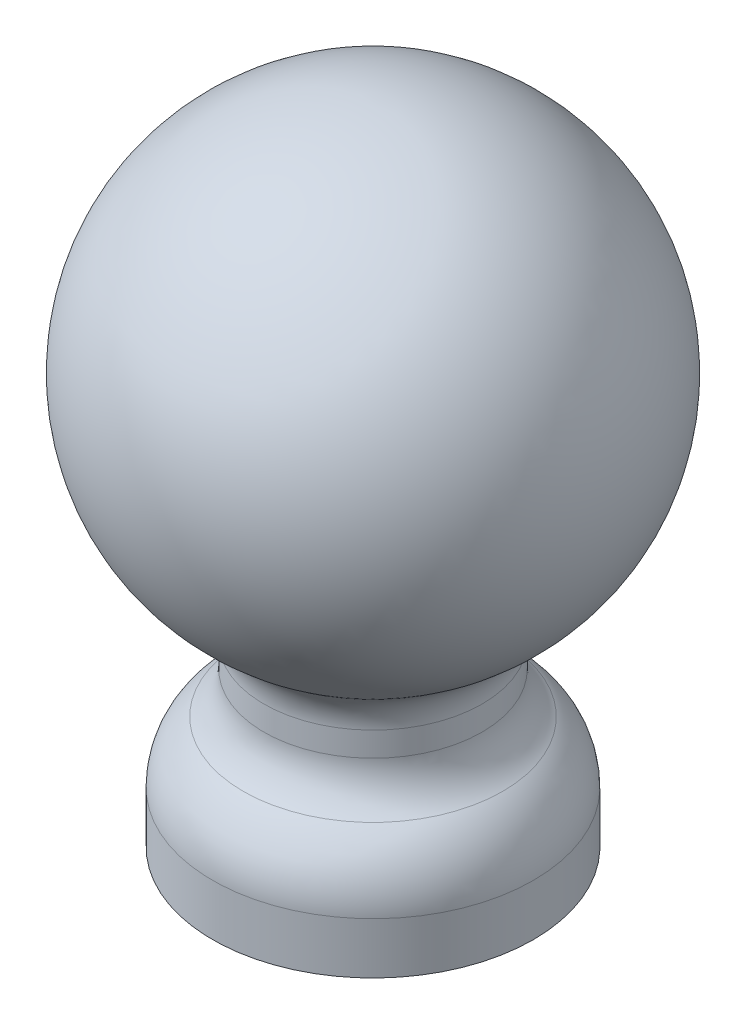
ISO-10303-21;
HEADER;
FILE_DESCRIPTION(('STEP AP214'),'2;1');
FILE_NAME('part.step','',(''),(''),'','','');
FILE_SCHEMA(('AUTOMOTIVE_DESIGN { 1 0 10303 214 1 1 1 1 }'));
ENDSEC;
DATA;
#1=APPLICATION_CONTEXT('core data for automotive mechanical design processes');
#2=APPLICATION_PROTOCOL_DEFINITION('international standard','automotive_design',2000,#1);
#3=PRODUCT_CONTEXT('',#1,'mechanical');
#4=PRODUCT('Part','Part','',(#3));
#5=PRODUCT_RELATED_PRODUCT_CATEGORY('part','',(#4));
#6=PRODUCT_DEFINITION_FORMATION('','',#4);
#7=PRODUCT_DEFINITION_CONTEXT('part definition',#1,'design');
#8=PRODUCT_DEFINITION('design','',#6,#7);
#9=PRODUCT_DEFINITION_SHAPE('','',#8);
#10=(LENGTH_UNIT() NAMED_UNIT(*) SI_UNIT(.MILLI.,.METRE.));
#11=(NAMED_UNIT(*) PLANE_ANGLE_UNIT() SI_UNIT($,.RADIAN.));
#12=(NAMED_UNIT(*) SI_UNIT($,.STERADIAN.) SOLID_ANGLE_UNIT());
#13=UNCERTAINTY_MEASURE_WITH_UNIT(LENGTH_MEASURE(1.E-05),#10,'distance_accuracy_value','');
#14=(GEOMETRIC_REPRESENTATION_CONTEXT(3) GLOBAL_UNCERTAINTY_ASSIGNED_CONTEXT((#13)) GLOBAL_UNIT_ASSIGNED_CONTEXT((#10,
#11,#12)) REPRESENTATION_CONTEXT('',''));
#15=CARTESIAN_POINT('',(0.,0.,0.));
#16=DIRECTION('',(0.,0.,1.));
#17=DIRECTION('',(1.,0.,0.));
#18=AXIS2_PLACEMENT_3D('',#15,#16,#17);
#19=CARTESIAN_POINT('',(0.,0.,0.));
#20=DIRECTION('',(0.,-1.,0.));
#21=DIRECTION('',(1.,0.,0.));
#22=AXIS2_PLACEMENT_3D('',#19,#20,#21);
#23=PLANE('',#22);
#24=CARTESIAN_POINT('',(0.,0.,0.));
#25=DIRECTION('',(0.,-1.,0.));
#26=DIRECTION('',(0.,0.,-1.));
#27=AXIS2_PLACEMENT_3D('',#24,#25,#26);
#28=CIRCLE('',#27,2.09999999999999);
#29=CARTESIAN_POINT('',(0.,0.,-2.09999999999999));
#30=VERTEX_POINT('',#29);
#31=EDGE_CURVE('E57',#30,#30,#28,.T.);
#32=ORIENTED_EDGE('',*,*,#31,.F.);
#33=EDGE_LOOP('',(#32));
#34=FACE_BOUND('',#33,.T.);
#35=CARTESIAN_POINT('',(0.,0.,0.));
#36=DIRECTION('',(0.,-1.,0.));
#37=DIRECTION('',(1.,0.,0.));
#38=AXIS2_PLACEMENT_3D('',#35,#36,#37);
#39=CIRCLE('',#38,12.5);
#40=CARTESIAN_POINT('',(12.5,0.,0.));
#41=VERTEX_POINT('',#40);
#42=EDGE_CURVE('E70',#41,#41,#39,.T.);
#43=ORIENTED_EDGE('',*,*,#42,.T.);
#44=EDGE_LOOP('',(#43));
#45=FACE_BOUND('',#44,.T.);
#46=ADVANCED_FACE('F37',(#34,#45),#23,.T.);
#47=CARTESIAN_POINT('',(0.,0.,0.));
#48=DIRECTION('',(0.,-1.,0.));
#49=DIRECTION('',(1.,0.,0.));
#50=AXIS2_PLACEMENT_3D('',#47,#48,#49);
#51=CYLINDRICAL_SURFACE('',#50,12.5);
#52=CARTESIAN_POINT('',(0.,4.,0.));
#53=DIRECTION('',(0.,1.,0.));
#54=DIRECTION('',(-1.,0.,0.));
#55=AXIS2_PLACEMENT_3D('',#52,#53,#54);
#56=CIRCLE('',#55,12.5);
#57=CARTESIAN_POINT('',(-12.5,4.,0.));
#58=VERTEX_POINT('',#57);
#59=EDGE_CURVE('E44',#58,#58,#56,.F.);
#60=ORIENTED_EDGE('',*,*,#59,.T.);
#61=EDGE_LOOP('',(#60));
#62=FACE_BOUND('',#61,.T.);
#63=ORIENTED_EDGE('',*,*,#42,.F.);
#64=EDGE_LOOP('',(#63));
#65=FACE_BOUND('',#64,.T.);
#66=ADVANCED_FACE('F75',(#62,#65),#51,.T.);
#67=CARTESIAN_POINT('',(0.,12.,0.));
#68=DIRECTION('',(0.,-1.,0.));
#69=DIRECTION('',(1.,0.,0.));
#70=AXIS2_PLACEMENT_3D('',#67,#68,#69);
#71=TOROIDAL_SURFACE('',#70,12.5,4.);
#72=CARTESIAN_POINT('',(0.,8.79999999999999,0.));
#73=DIRECTION('',(0.,1.,0.));
#74=DIRECTION('',(-1.,0.,0.));
#75=AXIS2_PLACEMENT_3D('',#72,#73,#74);
#76=CIRCLE('',#75,10.1);
#77=CARTESIAN_POINT('',(-10.1,8.79999999999999,0.));
#78=VERTEX_POINT('',#77);
#79=EDGE_CURVE('E11',#78,#78,#76,.T.);
#80=ORIENTED_EDGE('',*,*,#79,.T.);
#81=EDGE_LOOP('',(#80));
#82=FACE_BOUND('',#81,.T.);
#83=CARTESIAN_POINT('',(0.,12.,0.));
#84=DIRECTION('',(0.,-1.,0.));
#85=DIRECTION('',(1.,0.,0.));
#86=AXIS2_PLACEMENT_3D('',#83,#84,#85);
#87=CIRCLE('',#86,8.5);
#88=CARTESIAN_POINT('',(8.5,12.,0.));
#89=VERTEX_POINT('',#88);
#90=EDGE_CURVE('E67',#89,#89,#87,.T.);
#91=ORIENTED_EDGE('',*,*,#90,.T.);
#92=EDGE_LOOP('',(#91));
#93=FACE_BOUND('',#92,.T.);
#94=ADVANCED_FACE('F93',(#82,#93),#71,.F.);
#95=CARTESIAN_POINT('',(0.,0.,0.));
#96=DIRECTION('',(0.,-1.,0.));
#97=DIRECTION('',(1.,0.,0.));
#98=AXIS2_PLACEMENT_3D('',#95,#96,#97);
#99=CYLINDRICAL_SURFACE('',#98,8.5);
#100=CARTESIAN_POINT('',(0.,13.8961330097683,0.));
#101=DIRECTION('',(0.,-1.,0.));
#102=DIRECTION('',(1.,0.,0.));
#103=AXIS2_PLACEMENT_3D('',#100,#101,#102);
#104=CIRCLE('',#103,8.5);
#105=CARTESIAN_POINT('',(8.5,13.8961330097683,0.));
#106=VERTEX_POINT('',#105);
#107=EDGE_CURVE('E60',#106,#106,#104,.T.);
#108=ORIENTED_EDGE('',*,*,#107,.T.);
#109=EDGE_LOOP('',(#108));
#110=FACE_BOUND('',#109,.T.);
#111=ORIENTED_EDGE('',*,*,#90,.F.);
#112=EDGE_LOOP('',(#111));
#113=FACE_BOUND('',#112,.T.);
#114=ADVANCED_FACE('F100',(#110,#113),#99,.T.);
#115=CARTESIAN_POINT('',(0.,13.8961330097683,0.));
#116=DIRECTION('',(0.,-1.,0.));
#117=DIRECTION('',(1.,0.,0.));
#118=AXIS2_PLACEMENT_3D('',#115,#116,#117);
#119=TOROIDAL_SURFACE('',#118,12.5,4.);
#120=CARTESIAN_POINT('',(0.,17.1877451898105,0.));
#121=DIRECTION('',(0.,-1.,0.));
#122=DIRECTION('',(1.,0.,0.));
#123=AXIS2_PLACEMENT_3D('',#120,#121,#122);
#124=CIRCLE('',#123,10.2272727272727);
#125=CARTESIAN_POINT('',(10.2272727272727,17.1877451898105,0.));
#126=VERTEX_POINT('',#125);
#127=EDGE_CURVE('E56',#126,#126,#124,.T.);
#128=ORIENTED_EDGE('',*,*,#127,.T.);
#129=EDGE_LOOP('',(#128));
#130=FACE_BOUND('',#129,.T.);
#131=ORIENTED_EDGE('',*,*,#107,.F.);
#132=EDGE_LOOP('',(#131));
#133=FACE_BOUND('',#132,.T.);
#134=ADVANCED_FACE('F84',(#130,#133),#119,.F.);
#135=CARTESIAN_POINT('',(0.,32.,0.));
#136=DIRECTION('',(0.,-1.,0.));
#137=DIRECTION('',(1.,0.,0.));
#138=AXIS2_PLACEMENT_3D('',#135,#136,#137);
#139=SPHERICAL_SURFACE('',#138,18.);
#140=ORIENTED_EDGE('',*,*,#127,.F.);
#141=EDGE_LOOP('',(#140));
#142=FACE_BOUND('',#141,.T.);
#143=ADVANCED_FACE('F79',(#142),#139,.T.);
#144=CARTESIAN_POINT('',(0.,4.,0.));
#145=DIRECTION('',(0.,1.,0.));
#146=DIRECTION('',(-1.,0.,0.));
#147=AXIS2_PLACEMENT_3D('',#144,#145,#146);
#148=TOROIDAL_SURFACE('',#147,6.5,6.);
#149=ORIENTED_EDGE('',*,*,#79,.F.);
#150=EDGE_LOOP('',(#149));
#151=FACE_BOUND('',#150,.T.);
#152=ORIENTED_EDGE('',*,*,#59,.F.);
#153=EDGE_LOOP('',(#152));
#154=FACE_BOUND('',#153,.T.);
#155=ADVANCED_FACE('F39',(#151,#154),#148,.T.);
#156=CARTESIAN_POINT('',(0.,14.,0.));
#157=DIRECTION('',(0.,-1.,0.));
#158=DIRECTION('',(0.,0.,-1.));
#159=AXIS2_PLACEMENT_3D('',#156,#157,#158);
#160=CONICAL_SURFACE('',#159,2.1,1.02974425867665);
#161=CARTESIAN_POINT('',(0.,15.2618072999579,0.));
#162=VERTEX_POINT('',#161);
#163=VERTEX_LOOP('',#162);
#164=FACE_BOUND('',#163,.T.);
#165=CARTESIAN_POINT('',(0.,14.,0.));
#166=DIRECTION('',(0.,-1.,0.));
#167=DIRECTION('',(0.,0.,-1.));
#168=AXIS2_PLACEMENT_3D('',#165,#166,#167);
#169=CIRCLE('',#168,2.1);
#170=CARTESIAN_POINT('',(0.,14.,-2.1));
#171=VERTEX_POINT('',#170);
#172=EDGE_CURVE('E54',#171,#171,#169,.T.);
#173=ORIENTED_EDGE('',*,*,#172,.T.);
#174=EDGE_LOOP('',(#173));
#175=FACE_BOUND('',#174,.T.);
#176=ADVANCED_FACE('F47',(#164,#175),#160,.F.);
#177=CARTESIAN_POINT('',(0.,0.,0.));
#178=DIRECTION('',(0.,-1.,0.));
#179=DIRECTION('',(0.,0.,-1.));
#180=AXIS2_PLACEMENT_3D('',#177,#178,#179);
#181=CYLINDRICAL_SURFACE('',#180,2.09999999999999);
#182=ORIENTED_EDGE('',*,*,#172,.F.);
#183=EDGE_LOOP('',(#182));
#184=FACE_BOUND('',#183,.T.);
#185=ORIENTED_EDGE('',*,*,#31,.T.);
#186=EDGE_LOOP('',(#185));
#187=FACE_BOUND('',#186,.T.);
#188=ADVANCED_FACE('F50',(#184,#187),#181,.F.);
#189=CLOSED_SHELL('',(#46,#66,#94,#114,#134,#143,#155,#176,#188));
#190=MANIFOLD_SOLID_BREP('B2',#189);
#191=ADVANCED_BREP_SHAPE_REPRESENTATION('',(#18,#190),#14);
#192=SHAPE_DEFINITION_REPRESENTATION(#9,#191);
ENDSEC;
END-ISO-10303-21;
